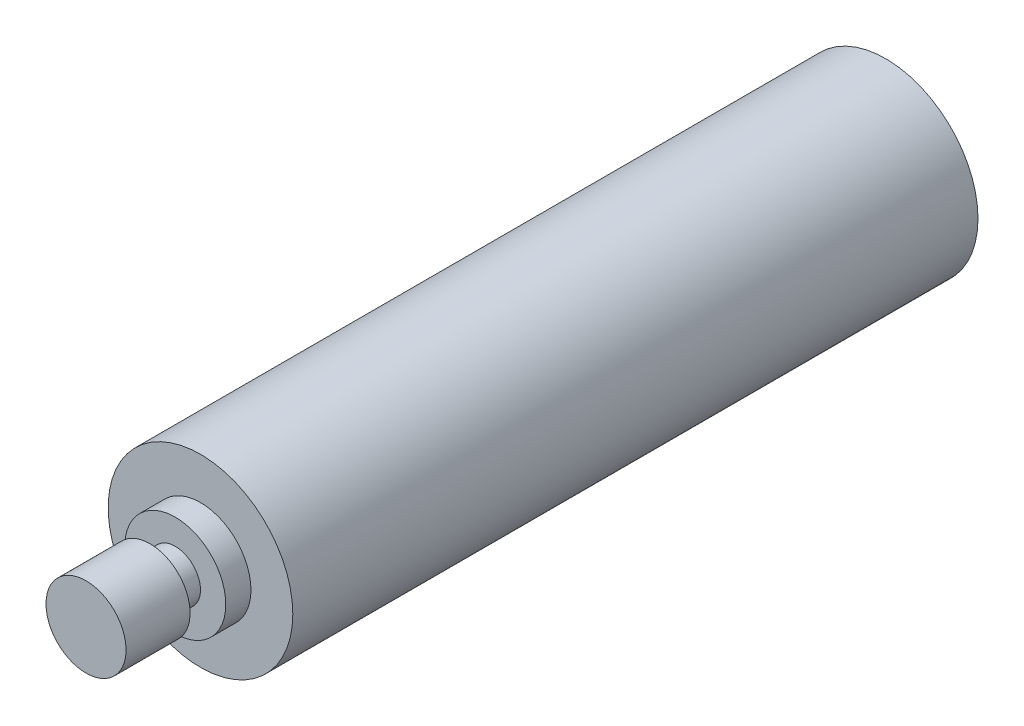
ISO-10303-21;
HEADER;
FILE_DESCRIPTION(('STEP AP214'),'2;1');
FILE_NAME('part.step','',(''),(''),'','','');
FILE_SCHEMA(('AUTOMOTIVE_DESIGN { 1 0 10303 214 1 1 1 1 }'));
ENDSEC;
DATA;
#1=APPLICATION_CONTEXT('core data for automotive mechanical design processes');
#2=APPLICATION_PROTOCOL_DEFINITION('international standard','automotive_design',2000,#1);
#3=PRODUCT_CONTEXT('',#1,'mechanical');
#4=PRODUCT('Part','Part','',(#3));
#5=PRODUCT_RELATED_PRODUCT_CATEGORY('part','',(#4));
#6=PRODUCT_DEFINITION_FORMATION('','',#4);
#7=PRODUCT_DEFINITION_CONTEXT('part definition',#1,'design');
#8=PRODUCT_DEFINITION('design','',#6,#7);
#9=PRODUCT_DEFINITION_SHAPE('','',#8);
#10=(LENGTH_UNIT() NAMED_UNIT(*) SI_UNIT(.MILLI.,.METRE.));
#11=(NAMED_UNIT(*) PLANE_ANGLE_UNIT() SI_UNIT($,.RADIAN.));
#12=(NAMED_UNIT(*) SI_UNIT($,.STERADIAN.) SOLID_ANGLE_UNIT());
#13=UNCERTAINTY_MEASURE_WITH_UNIT(LENGTH_MEASURE(1.E-05),#10,'distance_accuracy_value','');
#14=(GEOMETRIC_REPRESENTATION_CONTEXT(3) GLOBAL_UNCERTAINTY_ASSIGNED_CONTEXT((#13)) GLOBAL_UNIT_ASSIGNED_CONTEXT((#10,
#11,#12)) REPRESENTATION_CONTEXT('',''));
#15=CARTESIAN_POINT('',(0.,0.,0.));
#16=DIRECTION('',(0.,0.,1.));
#17=DIRECTION('',(1.,0.,0.));
#18=AXIS2_PLACEMENT_3D('',#15,#16,#17);
#19=CARTESIAN_POINT('',(0.,0.,81.534));
#20=DIRECTION('',(0.,0.,-1.));
#21=DIRECTION('',(-1.,0.,0.));
#22=AXIS2_PLACEMENT_3D('',#19,#20,#21);
#23=CYLINDRICAL_SURFACE('',#22,10.9855);
#24=CARTESIAN_POINT('',(0.,0.,81.534));
#25=DIRECTION('',(0.,0.,1.));
#26=DIRECTION('',(1.,0.,0.));
#27=AXIS2_PLACEMENT_3D('',#24,#25,#26);
#28=CIRCLE('',#27,10.9855);
#29=CARTESIAN_POINT('',(10.9855,0.,81.534));
#30=VERTEX_POINT('',#29);
#31=EDGE_CURVE('E51',#30,#30,#28,.T.);
#32=ORIENTED_EDGE('',*,*,#31,.F.);
#33=EDGE_LOOP('',(#32));
#34=FACE_BOUND('',#33,.T.);
#35=CARTESIAN_POINT('',(0.,0.,0.));
#36=DIRECTION('',(0.,0.,1.));
#37=DIRECTION('',(1.,0.,0.));
#38=AXIS2_PLACEMENT_3D('',#35,#36,#37);
#39=CIRCLE('',#38,10.9855);
#40=CARTESIAN_POINT('',(10.9855,0.,0.));
#41=VERTEX_POINT('',#40);
#42=EDGE_CURVE('E40',#41,#41,#39,.T.);
#43=ORIENTED_EDGE('',*,*,#42,.T.);
#44=EDGE_LOOP('',(#43));
#45=FACE_BOUND('',#44,.T.);
#46=ADVANCED_FACE('F37',(#34,#45),#23,.T.);
#47=CARTESIAN_POINT('',(0.,0.,81.534));
#48=DIRECTION('',(0.,0.,1.));
#49=DIRECTION('',(1.,0.,0.));
#50=AXIS2_PLACEMENT_3D('',#47,#48,#49);
#51=PLANE('',#50);
#52=CARTESIAN_POINT('',(0.,0.,81.534));
#53=DIRECTION('',(0.,0.,1.));
#54=DIRECTION('',(1.,0.,0.));
#55=AXIS2_PLACEMENT_3D('',#52,#53,#54);
#56=CIRCLE('',#55,6.0071);
#57=CARTESIAN_POINT('',(6.0071,0.,81.534));
#58=VERTEX_POINT('',#57);
#59=EDGE_CURVE('E45',#58,#58,#56,.T.);
#60=ORIENTED_EDGE('',*,*,#59,.F.);
#61=EDGE_LOOP('',(#60));
#62=FACE_BOUND('',#61,.T.);
#63=ORIENTED_EDGE('',*,*,#31,.T.);
#64=EDGE_LOOP('',(#63));
#65=FACE_BOUND('',#64,.T.);
#66=ADVANCED_FACE('F72',(#62,#65),#51,.T.);
#67=CARTESIAN_POINT('',(0.,0.,0.));
#68=DIRECTION('',(0.,0.,1.));
#69=DIRECTION('',(1.,0.,0.));
#70=AXIS2_PLACEMENT_3D('',#67,#68,#69);
#71=PLANE('',#70);
#72=ORIENTED_EDGE('',*,*,#42,.F.);
#73=EDGE_LOOP('',(#72));
#74=FACE_BOUND('',#73,.T.);
#75=ADVANCED_FACE('F69',(#74),#71,.F.);
#76=CARTESIAN_POINT('',(0.,0.,84.534));
#77=DIRECTION('',(0.,0.,-1.));
#78=DIRECTION('',(-1.,0.,0.));
#79=AXIS2_PLACEMENT_3D('',#76,#77,#78);
#80=CYLINDRICAL_SURFACE('',#79,6.0071);
#81=CARTESIAN_POINT('',(0.,0.,84.534));
#82=DIRECTION('',(0.,0.,1.));
#83=DIRECTION('',(1.,0.,0.));
#84=AXIS2_PLACEMENT_3D('',#81,#82,#83);
#85=CIRCLE('',#84,6.0071);
#86=CARTESIAN_POINT('',(6.0071,0.,84.534));
#87=VERTEX_POINT('',#86);
#88=EDGE_CURVE('E57',#87,#87,#85,.T.);
#89=ORIENTED_EDGE('',*,*,#88,.F.);
#90=EDGE_LOOP('',(#89));
#91=FACE_BOUND('',#90,.T.);
#92=ORIENTED_EDGE('',*,*,#59,.T.);
#93=EDGE_LOOP('',(#92));
#94=FACE_BOUND('',#93,.T.);
#95=ADVANCED_FACE('F71',(#91,#94),#80,.T.);
#96=CARTESIAN_POINT('',(0.,0.,84.534));
#97=DIRECTION('',(0.,0.,1.));
#98=DIRECTION('',(1.,0.,0.));
#99=AXIS2_PLACEMENT_3D('',#96,#97,#98);
#100=PLANE('',#99);
#101=CARTESIAN_POINT('',(0.,0.,84.534));
#102=DIRECTION('',(0.,0.,1.));
#103=DIRECTION('',(1.,0.,0.));
#104=AXIS2_PLACEMENT_3D('',#101,#102,#103);
#105=CIRCLE('',#104,2.9972);
#106=CARTESIAN_POINT('',(2.9972,0.,84.534));
#107=VERTEX_POINT('',#106);
#108=EDGE_CURVE('E10',#107,#107,#105,.T.);
#109=ORIENTED_EDGE('',*,*,#108,.F.);
#110=EDGE_LOOP('',(#109));
#111=FACE_BOUND('',#110,.T.);
#112=ORIENTED_EDGE('',*,*,#88,.T.);
#113=EDGE_LOOP('',(#112));
#114=FACE_BOUND('',#113,.T.);
#115=ADVANCED_FACE('F77',(#111,#114),#100,.T.);
#116=CARTESIAN_POINT('',(0.,0.,87.534));
#117=DIRECTION('',(0.,0.,-1.));
#118=DIRECTION('',(-1.,0.,0.));
#119=AXIS2_PLACEMENT_3D('',#116,#117,#118);
#120=CYLINDRICAL_SURFACE('',#119,2.9972);
#121=CARTESIAN_POINT('',(0.,0.,87.534));
#122=DIRECTION('',(0.,0.,1.));
#123=DIRECTION('',(1.,0.,0.));
#124=AXIS2_PLACEMENT_3D('',#121,#122,#123);
#125=CIRCLE('',#124,2.9972);
#126=CARTESIAN_POINT('',(2.9972,0.,87.534));
#127=VERTEX_POINT('',#126);
#128=EDGE_CURVE('E55',#127,#127,#125,.T.);
#129=ORIENTED_EDGE('',*,*,#128,.F.);
#130=EDGE_LOOP('',(#129));
#131=FACE_BOUND('',#130,.T.);
#132=ORIENTED_EDGE('',*,*,#108,.T.);
#133=EDGE_LOOP('',(#132));
#134=FACE_BOUND('',#133,.T.);
#135=ADVANCED_FACE('F107',(#131,#134),#120,.T.);
#136=CARTESIAN_POINT('',(0.,0.,95.154));
#137=DIRECTION('',(0.,0.,-1.));
#138=DIRECTION('',(-1.,0.,0.));
#139=AXIS2_PLACEMENT_3D('',#136,#137,#138);
#140=CYLINDRICAL_SURFACE('',#139,4.7625);
#141=CARTESIAN_POINT('',(0.,0.,95.154));
#142=DIRECTION('',(0.,0.,1.));
#143=DIRECTION('',(1.,0.,0.));
#144=AXIS2_PLACEMENT_3D('',#141,#142,#143);
#145=CIRCLE('',#144,4.7625);
#146=CARTESIAN_POINT('',(-4.7625,0.,95.154));
#147=VERTEX_POINT('',#146);
#148=EDGE_CURVE('E159',#147,#147,#145,.T.);
#149=CARTESIAN_POINT('',(0.,0.,87.534));
#150=DIRECTION('',(0.,0.,1.));
#151=DIRECTION('',(1.,0.,0.));
#152=AXIS2_PLACEMENT_3D('',#149,#150,#151);
#153=CIRCLE('',#152,4.7625);
#154=CARTESIAN_POINT('',(-4.7625,0.,87.534));
#155=VERTEX_POINT('',#154);
#156=EDGE_CURVE('E156',#155,#155,#153,.T.);
#157=CARTESIAN_POINT('',(-4.7625,0.,95.154));
#158=CARTESIAN_POINT('',(-4.7625,0.,95.074625));
#159=CARTESIAN_POINT('',(-4.7625,0.,94.99525));
#160=CARTESIAN_POINT('',(-4.7625,0.,94.8365));
#161=CARTESIAN_POINT('',(-4.7625,0.,94.757125));
#162=CARTESIAN_POINT('',(-4.7625,0.,94.598375));
#163=CARTESIAN_POINT('',(-4.7625,0.,94.519));
#164=CARTESIAN_POINT('',(-4.7625,0.,94.36025));
#165=CARTESIAN_POINT('',(-4.7625,0.,94.280875));
#166=CARTESIAN_POINT('',(-4.7625,0.,94.122125));
#167=CARTESIAN_POINT('',(-4.7625,0.,94.04275));
#168=CARTESIAN_POINT('',(-4.7625,0.,93.884));
#169=CARTESIAN_POINT('',(-4.7625,0.,93.804625));
#170=CARTESIAN_POINT('',(-4.7625,0.,93.645875));
#171=CARTESIAN_POINT('',(-4.7625,0.,93.5665));
#172=CARTESIAN_POINT('',(-4.7625,0.,93.40775));
#173=CARTESIAN_POINT('',(-4.7625,0.,93.328375));
#174=CARTESIAN_POINT('',(-4.7625,0.,93.169625));
#175=CARTESIAN_POINT('',(-4.7625,0.,93.09025));
#176=CARTESIAN_POINT('',(-4.7625,0.,92.9315));
#177=CARTESIAN_POINT('',(-4.7625,0.,92.852125));
#178=CARTESIAN_POINT('',(-4.7625,0.,92.693375));
#179=CARTESIAN_POINT('',(-4.7625,0.,92.614));
#180=CARTESIAN_POINT('',(-4.7625,0.,92.45525));
#181=CARTESIAN_POINT('',(-4.7625,0.,92.375875));
#182=CARTESIAN_POINT('',(-4.7625,0.,92.217125));
#183=CARTESIAN_POINT('',(-4.7625,0.,92.13775));
#184=CARTESIAN_POINT('',(-4.7625,0.,91.979));
#185=CARTESIAN_POINT('',(-4.7625,0.,91.899625));
#186=CARTESIAN_POINT('',(-4.7625,0.,91.740875));
#187=CARTESIAN_POINT('',(-4.7625,0.,91.6615));
#188=CARTESIAN_POINT('',(-4.7625,0.,91.50275));
#189=CARTESIAN_POINT('',(-4.7625,0.,91.423375));
#190=CARTESIAN_POINT('',(-4.7625,0.,91.264625));
#191=CARTESIAN_POINT('',(-4.7625,0.,91.18525));
#192=CARTESIAN_POINT('',(-4.7625,0.,91.0265));
#193=CARTESIAN_POINT('',(-4.7625,0.,90.947125));
#194=CARTESIAN_POINT('',(-4.7625,0.,90.788375));
#195=CARTESIAN_POINT('',(-4.7625,0.,90.709));
#196=CARTESIAN_POINT('',(-4.7625,0.,90.55025));
#197=CARTESIAN_POINT('',(-4.7625,0.,90.470875));
#198=CARTESIAN_POINT('',(-4.7625,0.,90.312125));
#199=CARTESIAN_POINT('',(-4.7625,0.,90.23275));
#200=CARTESIAN_POINT('',(-4.7625,0.,90.074));
#201=CARTESIAN_POINT('',(-4.7625,0.,89.994625));
#202=CARTESIAN_POINT('',(-4.7625,0.,89.835875));
#203=CARTESIAN_POINT('',(-4.7625,0.,89.7565));
#204=CARTESIAN_POINT('',(-4.7625,0.,89.59775));
#205=CARTESIAN_POINT('',(-4.7625,0.,89.518375));
#206=CARTESIAN_POINT('',(-4.7625,0.,89.359625));
#207=CARTESIAN_POINT('',(-4.7625,0.,89.28025));
#208=CARTESIAN_POINT('',(-4.7625,0.,89.1215));
#209=CARTESIAN_POINT('',(-4.7625,0.,89.042125));
#210=CARTESIAN_POINT('',(-4.7625,0.,88.883375));
#211=CARTESIAN_POINT('',(-4.7625,0.,88.804));
#212=CARTESIAN_POINT('',(-4.7625,0.,88.64525));
#213=CARTESIAN_POINT('',(-4.7625,0.,88.565875));
#214=CARTESIAN_POINT('',(-4.7625,0.,88.407125));
#215=CARTESIAN_POINT('',(-4.7625,0.,88.32775));
#216=CARTESIAN_POINT('',(-4.7625,0.,88.169));
#217=CARTESIAN_POINT('',(-4.7625,0.,88.089625));
#218=CARTESIAN_POINT('',(-4.7625,0.,87.930875));
#219=CARTESIAN_POINT('',(-4.7625,0.,87.8515));
#220=CARTESIAN_POINT('',(-4.7625,0.,87.69275));
#221=CARTESIAN_POINT('',(-4.7625,0.,87.613375));
#222=CARTESIAN_POINT('',(-4.7625,0.,87.534));
#223=B_SPLINE_CURVE_WITH_KNOTS('',3,(#157,#158,#159,#160,#161,#162,#163,#164,#165,#166,#167,
#168,#169,#170,#171,#172,#173,#174,#175,#176,#177,#178,#179,#180,#181,#182,#183,#184,#185,#186,
#187,#188,#189,#190,#191,#192,#193,#194,#195,#196,#197,#198,#199,#200,#201,#202,#203,#204,#205,
#206,#207,#208,#209,#210,#211,#212,#213,#214,#215,#216,#217,#218,#219,#220,#221,#222),
.UNSPECIFIED.,.F.,.F.,(4,2,2,2,2,2,2,2,2,2,2,2,2,2,2,2,2,2,2,2,2,2,2,2,2,2,2,2,2,2,2,2,4),(0.,
0.238124999999992,0.476249999999998,0.714374999999989,0.952499999999995,1.19062499999999,
1.42874999999999,1.666875,1.90499999999999,2.143125,2.38124999999999,2.61937499999999,2.8575,
3.09562499999999,3.33375,3.57187499999999,3.80999999999999,4.048125,4.28624999999999,4.524375,
4.76249999999999,5.00062499999999,5.23875,5.47687499999999,5.715,5.95312499999999,6.19125,
6.429375,6.66749999999999,6.905625,7.14374999999999,7.381875,7.62),.UNSPECIFIED.);
#224=EDGE_CURVE('BSEAM117',#147,#155,#223,.T.);
#225=ORIENTED_EDGE('',*,*,#148,.F.);
#226=ORIENTED_EDGE('',*,*,#156,.T.);
#227=ORIENTED_EDGE('',*,*,#224,.T.);
#228=ORIENTED_EDGE('',*,*,#224,.F.);
#229=EDGE_LOOP('',(#225,#227,#226,#228));
#230=FACE_BOUND('',#229,.T.);
#231=ADVANCED_FACE('F117',(#230),#140,.T.);
#232=CARTESIAN_POINT('',(0.,0.,95.154));
#233=DIRECTION('',(0.,0.,1.));
#234=DIRECTION('',(1.,0.,0.));
#235=AXIS2_PLACEMENT_3D('',#232,#233,#234);
#236=PLANE('',#235);
#237=ORIENTED_EDGE('',*,*,#148,.T.);
#238=EDGE_LOOP('',(#237));
#239=FACE_BOUND('',#238,.T.);
#240=ADVANCED_FACE('F127',(#239),#236,.T.);
#241=CARTESIAN_POINT('',(0.,0.,87.534));
#242=DIRECTION('',(0.,0.,1.));
#243=DIRECTION('',(1.,0.,0.));
#244=AXIS2_PLACEMENT_3D('',#241,#242,#243);
#245=PLANE('',#244);
#246=ORIENTED_EDGE('',*,*,#128,.T.);
#247=EDGE_LOOP('',(#246));
#248=FACE_BOUND('',#247,.T.);
#249=ORIENTED_EDGE('',*,*,#156,.F.);
#250=EDGE_LOOP('',(#249));
#251=FACE_BOUND('',#250,.T.);
#252=ADVANCED_FACE('F137',(#248,#251),#245,.F.);
#253=CLOSED_SHELL('',(#46,#66,#75,#95,#115,#135,#231,#240,#252));
#254=MANIFOLD_SOLID_BREP('B2',#253);
#255=ADVANCED_BREP_SHAPE_REPRESENTATION('',(#18,#254),#14);
#256=SHAPE_DEFINITION_REPRESENTATION(#9,#255);
ENDSEC;
END-ISO-10303-21;
